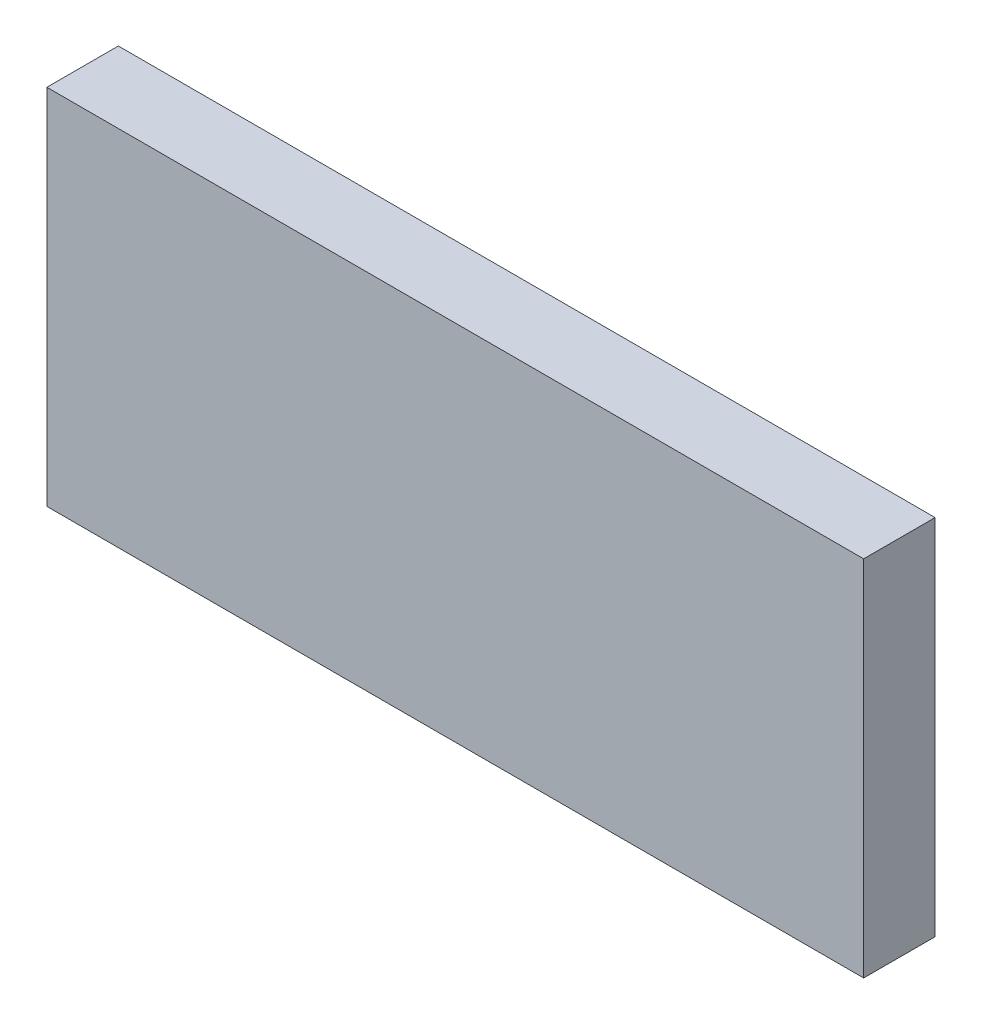
ISO-10303-21;
HEADER;
FILE_DESCRIPTION(('STEP AP214'),'2;1');
FILE_NAME('part.step','',(''),(''),'','','');
FILE_SCHEMA(('AUTOMOTIVE_DESIGN { 1 0 10303 214 1 1 1 1 }'));
ENDSEC;
DATA;
#1=APPLICATION_CONTEXT('core data for automotive mechanical design processes');
#2=APPLICATION_PROTOCOL_DEFINITION('international standard','automotive_design',2000,#1);
#3=PRODUCT_CONTEXT('',#1,'mechanical');
#4=PRODUCT('Part','Part','',(#3));
#5=PRODUCT_RELATED_PRODUCT_CATEGORY('part','',(#4));
#6=PRODUCT_DEFINITION_FORMATION('','',#4);
#7=PRODUCT_DEFINITION_CONTEXT('part definition',#1,'design');
#8=PRODUCT_DEFINITION('design','',#6,#7);
#9=PRODUCT_DEFINITION_SHAPE('','',#8);
#10=(LENGTH_UNIT() NAMED_UNIT(*) SI_UNIT(.MILLI.,.METRE.));
#11=(NAMED_UNIT(*) PLANE_ANGLE_UNIT() SI_UNIT($,.RADIAN.));
#12=(NAMED_UNIT(*) SI_UNIT($,.STERADIAN.) SOLID_ANGLE_UNIT());
#13=UNCERTAINTY_MEASURE_WITH_UNIT(LENGTH_MEASURE(1.E-05),#10,'distance_accuracy_value','');
#14=(GEOMETRIC_REPRESENTATION_CONTEXT(3) GLOBAL_UNCERTAINTY_ASSIGNED_CONTEXT((#13)) GLOBAL_UNIT_ASSIGNED_CONTEXT((#10,
#11,#12)) REPRESENTATION_CONTEXT('',''));
#15=CARTESIAN_POINT('',(0.,0.,0.));
#16=DIRECTION('',(0.,0.,1.));
#17=DIRECTION('',(1.,0.,0.));
#18=AXIS2_PLACEMENT_3D('',#15,#16,#17);
#19=CARTESIAN_POINT('',(-5.715,-2.54,1.));
#20=DIRECTION('',(1.,0.,0.));
#21=DIRECTION('',(0.,0.,-1.));
#22=AXIS2_PLACEMENT_3D('',#19,#20,#21);
#23=PLANE('',#22);
#24=DIRECTION('',(0.,-1.,0.));
#25=VECTOR('',#24,1.);
#26=CARTESIAN_POINT('',(-5.715,-2.54,0.));
#27=LINE('',#26,#25);
#28=CARTESIAN_POINT('',(-5.715,2.54,0.));
#29=VERTEX_POINT('',#28);
#30=CARTESIAN_POINT('',(-5.715,-2.54,0.));
#31=VERTEX_POINT('',#30);
#32=EDGE_CURVE('E95',#29,#31,#27,.T.);
#33=ORIENTED_EDGE('',*,*,#32,.T.);
#34=DIRECTION('',(0.,0.,-1.));
#35=VECTOR('',#34,1.);
#36=CARTESIAN_POINT('',(-5.715,-2.54,1.));
#37=LINE('',#36,#35);
#38=CARTESIAN_POINT('',(-5.715,-2.54,1.));
#39=VERTEX_POINT('',#38);
#40=EDGE_CURVE('E11',#39,#31,#37,.T.);
#41=ORIENTED_EDGE('',*,*,#40,.F.);
#42=DIRECTION('',(0.,-1.,0.));
#43=VECTOR('',#42,1.);
#44=CARTESIAN_POINT('',(-5.715,-2.54,1.));
#45=LINE('',#44,#43);
#46=CARTESIAN_POINT('',(-5.715,2.54,1.));
#47=VERTEX_POINT('',#46);
#48=EDGE_CURVE('E83',#47,#39,#45,.T.);
#49=ORIENTED_EDGE('',*,*,#48,.F.);
#50=DIRECTION('',(0.,0.,-1.));
#51=VECTOR('',#50,1.);
#52=CARTESIAN_POINT('',(-5.715,2.54,1.));
#53=LINE('',#52,#51);
#54=EDGE_CURVE('E91',#47,#29,#53,.T.);
#55=ORIENTED_EDGE('',*,*,#54,.T.);
#56=EDGE_LOOP('',(#33,#41,#49,#55));
#57=FACE_BOUND('',#56,.T.);
#58=ADVANCED_FACE('F32',(#57),#23,.F.);
#59=CARTESIAN_POINT('',(5.715,-2.54,1.));
#60=DIRECTION('',(0.,1.,0.));
#61=DIRECTION('',(0.,0.,1.));
#62=AXIS2_PLACEMENT_3D('',#59,#60,#61);
#63=PLANE('',#62);
#64=DIRECTION('',(1.,0.,0.));
#65=VECTOR('',#64,1.);
#66=CARTESIAN_POINT('',(5.715,-2.54,0.));
#67=LINE('',#66,#65);
#68=CARTESIAN_POINT('',(5.715,-2.54,0.));
#69=VERTEX_POINT('',#68);
#70=EDGE_CURVE('E87',#31,#69,#67,.T.);
#71=ORIENTED_EDGE('',*,*,#70,.T.);
#72=DIRECTION('',(0.,0.,-1.));
#73=VECTOR('',#72,1.);
#74=CARTESIAN_POINT('',(5.715,-2.54,1.));
#75=LINE('',#74,#73);
#76=CARTESIAN_POINT('',(5.715,-2.54,1.));
#77=VERTEX_POINT('',#76);
#78=EDGE_CURVE('E40',#77,#69,#75,.T.);
#79=ORIENTED_EDGE('',*,*,#78,.F.);
#80=DIRECTION('',(1.,0.,0.));
#81=VECTOR('',#80,1.);
#82=CARTESIAN_POINT('',(5.715,-2.54,1.));
#83=LINE('',#82,#81);
#84=EDGE_CURVE('E78',#39,#77,#83,.T.);
#85=ORIENTED_EDGE('',*,*,#84,.F.);
#86=ORIENTED_EDGE('',*,*,#40,.T.);
#87=EDGE_LOOP('',(#71,#79,#85,#86));
#88=FACE_BOUND('',#87,.T.);
#89=ADVANCED_FACE('F86',(#88),#63,.F.);
#90=CARTESIAN_POINT('',(5.715,2.54,1.));
#91=DIRECTION('',(-1.,0.,0.));
#92=DIRECTION('',(0.,0.,1.));
#93=AXIS2_PLACEMENT_3D('',#90,#91,#92);
#94=PLANE('',#93);
#95=DIRECTION('',(0.,1.,0.));
#96=VECTOR('',#95,1.);
#97=CARTESIAN_POINT('',(5.715,2.54,0.));
#98=LINE('',#97,#96);
#99=CARTESIAN_POINT('',(5.715,2.54,0.));
#100=VERTEX_POINT('',#99);
#101=EDGE_CURVE('E65',#69,#100,#98,.T.);
#102=ORIENTED_EDGE('',*,*,#101,.T.);
#103=DIRECTION('',(0.,0.,-1.));
#104=VECTOR('',#103,1.);
#105=CARTESIAN_POINT('',(5.715,2.54,1.));
#106=LINE('',#105,#104);
#107=CARTESIAN_POINT('',(5.715,2.54,1.));
#108=VERTEX_POINT('',#107);
#109=EDGE_CURVE('E88',#108,#100,#106,.T.);
#110=ORIENTED_EDGE('',*,*,#109,.F.);
#111=DIRECTION('',(0.,1.,0.));
#112=VECTOR('',#111,1.);
#113=CARTESIAN_POINT('',(5.715,2.54,1.));
#114=LINE('',#113,#112);
#115=EDGE_CURVE('E81',#77,#108,#114,.T.);
#116=ORIENTED_EDGE('',*,*,#115,.F.);
#117=ORIENTED_EDGE('',*,*,#78,.T.);
#118=EDGE_LOOP('',(#102,#110,#116,#117));
#119=FACE_BOUND('',#118,.T.);
#120=ADVANCED_FACE('F89',(#119),#94,.F.);
#121=CARTESIAN_POINT('',(-5.715,2.54,1.));
#122=DIRECTION('',(0.,-1.,0.));
#123=DIRECTION('',(0.,0.,-1.));
#124=AXIS2_PLACEMENT_3D('',#121,#122,#123);
#125=PLANE('',#124);
#126=DIRECTION('',(-1.,0.,0.));
#127=VECTOR('',#126,1.);
#128=CARTESIAN_POINT('',(-5.715,2.54,0.));
#129=LINE('',#128,#127);
#130=EDGE_CURVE('E71',#100,#29,#129,.T.);
#131=ORIENTED_EDGE('',*,*,#130,.T.);
#132=ORIENTED_EDGE('',*,*,#54,.F.);
#133=DIRECTION('',(-1.,0.,0.));
#134=VECTOR('',#133,1.);
#135=CARTESIAN_POINT('',(-5.715,2.54,1.));
#136=LINE('',#135,#134);
#137=EDGE_CURVE('E48',#108,#47,#136,.T.);
#138=ORIENTED_EDGE('',*,*,#137,.F.);
#139=ORIENTED_EDGE('',*,*,#109,.T.);
#140=EDGE_LOOP('',(#131,#132,#138,#139));
#141=FACE_BOUND('',#140,.T.);
#142=ADVANCED_FACE('F102',(#141),#125,.F.);
#143=CARTESIAN_POINT('',(0.,0.,1.));
#144=DIRECTION('',(0.,0.,-1.));
#145=DIRECTION('',(-1.,0.,0.));
#146=AXIS2_PLACEMENT_3D('',#143,#144,#145);
#147=PLANE('',#146);
#148=ORIENTED_EDGE('',*,*,#48,.T.);
#149=ORIENTED_EDGE('',*,*,#84,.T.);
#150=ORIENTED_EDGE('',*,*,#115,.T.);
#151=ORIENTED_EDGE('',*,*,#137,.T.);
#152=EDGE_LOOP('',(#148,#149,#150,#151));
#153=FACE_BOUND('',#152,.T.);
#154=ADVANCED_FACE('F79',(#153),#147,.F.);
#155=CARTESIAN_POINT('',(0.,0.,0.));
#156=DIRECTION('',(0.,0.,-1.));
#157=DIRECTION('',(-1.,0.,0.));
#158=AXIS2_PLACEMENT_3D('',#155,#156,#157);
#159=PLANE('',#158);
#160=ORIENTED_EDGE('',*,*,#32,.F.);
#161=ORIENTED_EDGE('',*,*,#130,.F.);
#162=ORIENTED_EDGE('',*,*,#101,.F.);
#163=ORIENTED_EDGE('',*,*,#70,.F.);
#164=EDGE_LOOP('',(#160,#161,#162,#163));
#165=FACE_BOUND('',#164,.T.);
#166=ADVANCED_FACE('F105',(#165),#159,.T.);
#167=CLOSED_SHELL('',(#58,#89,#120,#142,#154,#166));
#168=MANIFOLD_SOLID_BREP('B2',#167);
#169=ADVANCED_BREP_SHAPE_REPRESENTATION('',(#18,#168),#14);
#170=SHAPE_DEFINITION_REPRESENTATION(#9,#169);
ENDSEC;
END-ISO-10303-21;
